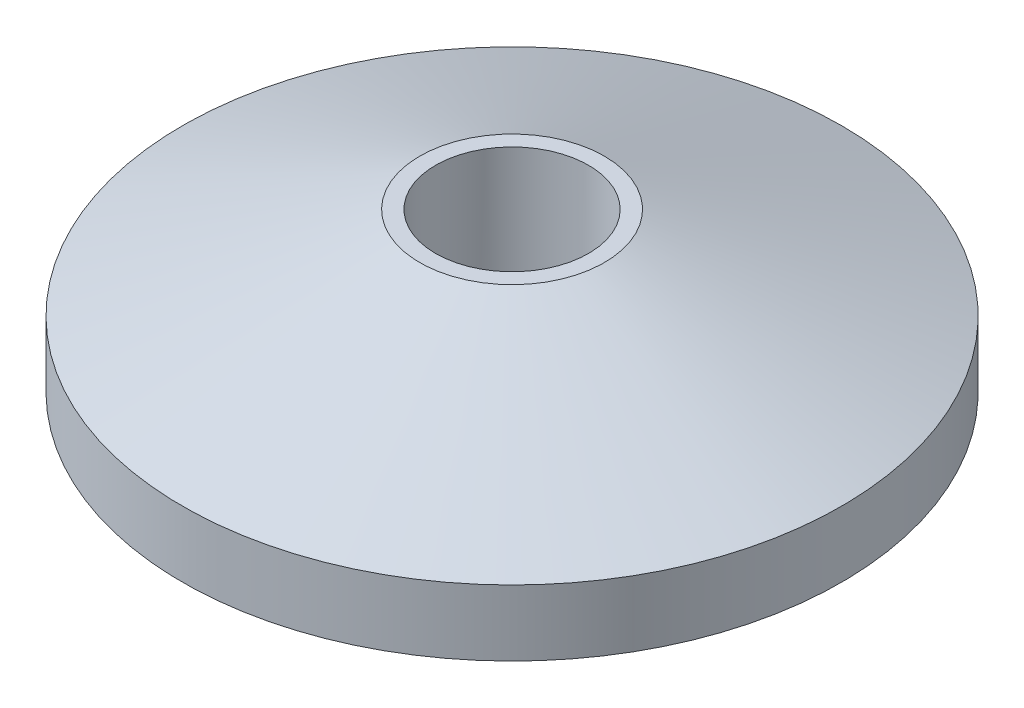
ISO-10303-21;
HEADER;
FILE_DESCRIPTION(('STEP AP214'),'2;1');
FILE_NAME('part.step','',(''),(''),'','','');
FILE_SCHEMA(('AUTOMOTIVE_DESIGN { 1 0 10303 214 1 1 1 1 }'));
ENDSEC;
DATA;
#1=APPLICATION_CONTEXT('core data for automotive mechanical design processes');
#2=APPLICATION_PROTOCOL_DEFINITION('international standard','automotive_design',2000,#1);
#3=PRODUCT_CONTEXT('',#1,'mechanical');
#4=PRODUCT('Part','Part','',(#3));
#5=PRODUCT_RELATED_PRODUCT_CATEGORY('part','',(#4));
#6=PRODUCT_DEFINITION_FORMATION('','',#4);
#7=PRODUCT_DEFINITION_CONTEXT('part definition',#1,'design');
#8=PRODUCT_DEFINITION('design','',#6,#7);
#9=PRODUCT_DEFINITION_SHAPE('','',#8);
#10=(LENGTH_UNIT() NAMED_UNIT(*) SI_UNIT(.MILLI.,.METRE.));
#11=(NAMED_UNIT(*) PLANE_ANGLE_UNIT() SI_UNIT($,.RADIAN.));
#12=(NAMED_UNIT(*) SI_UNIT($,.STERADIAN.) SOLID_ANGLE_UNIT());
#13=UNCERTAINTY_MEASURE_WITH_UNIT(LENGTH_MEASURE(1.E-05),#10,'distance_accuracy_value','');
#14=(GEOMETRIC_REPRESENTATION_CONTEXT(3) GLOBAL_UNCERTAINTY_ASSIGNED_CONTEXT((#13)) GLOBAL_UNIT_ASSIGNED_CONTEXT((#10,
#11,#12)) REPRESENTATION_CONTEXT('',''));
#15=CARTESIAN_POINT('',(0.,0.,0.));
#16=DIRECTION('',(0.,0.,1.));
#17=DIRECTION('',(1.,0.,0.));
#18=AXIS2_PLACEMENT_3D('',#15,#16,#17);
#19=CARTESIAN_POINT('',(0.,0.,0.));
#20=DIRECTION('',(0.,-1.,0.));
#21=DIRECTION('',(0.,0.,-1.));
#22=AXIS2_PLACEMENT_3D('',#19,#20,#21);
#23=PLANE('',#22);
#24=CARTESIAN_POINT('',(0.,0.,0.));
#25=DIRECTION('',(0.,-1.,0.));
#26=DIRECTION('',(0.,0.,-1.));
#27=AXIS2_PLACEMENT_3D('',#24,#25,#26);
#28=CIRCLE('',#27,12.5);
#29=CARTESIAN_POINT('',(0.,0.,-12.5));
#30=VERTEX_POINT('',#29);
#31=EDGE_CURVE('E11',#30,#30,#28,.T.);
#32=ORIENTED_EDGE('',*,*,#31,.T.);
#33=EDGE_LOOP('',(#32));
#34=FACE_BOUND('',#33,.T.);
#35=ADVANCED_FACE('F33',(#34),#23,.T.);
#36=CARTESIAN_POINT('',(0.,6.,0.));
#37=DIRECTION('',(0.,-1.,0.));
#38=DIRECTION('',(0.,0.,-1.));
#39=AXIS2_PLACEMENT_3D('',#36,#37,#38);
#40=CYLINDRICAL_SURFACE('',#39,12.5);
#41=CARTESIAN_POINT('',(0.,2.5,0.));
#42=DIRECTION('',(0.,-1.,0.));
#43=DIRECTION('',(0.,0.,-1.));
#44=AXIS2_PLACEMENT_3D('',#41,#42,#43);
#45=CIRCLE('',#44,12.5);
#46=CARTESIAN_POINT('',(0.,2.5,-12.5));
#47=VERTEX_POINT('',#46);
#48=EDGE_CURVE('E39',#47,#47,#45,.T.);
#49=ORIENTED_EDGE('',*,*,#48,.T.);
#50=EDGE_LOOP('',(#49));
#51=FACE_BOUND('',#50,.T.);
#52=ORIENTED_EDGE('',*,*,#31,.F.);
#53=EDGE_LOOP('',(#52));
#54=FACE_BOUND('',#53,.T.);
#55=ADVANCED_FACE('F69',(#51,#54),#40,.T.);
#56=CARTESIAN_POINT('',(0.,2.5,0.));
#57=DIRECTION('',(0.,-1.,0.));
#58=DIRECTION('',(0.,0.,-1.));
#59=AXIS2_PLACEMENT_3D('',#56,#57,#58);
#60=CONICAL_SURFACE('',#59,12.5,1.19990503798223);
#61=CARTESIAN_POINT('',(0.,6.,0.));
#62=DIRECTION('',(0.,-1.,0.));
#63=DIRECTION('',(0.,0.,-1.));
#64=AXIS2_PLACEMENT_3D('',#61,#62,#63);
#65=CIRCLE('',#64,3.5);
#66=CARTESIAN_POINT('',(0.,6.,-3.5));
#67=VERTEX_POINT('',#66);
#68=EDGE_CURVE('E43',#67,#67,#65,.T.);
#69=CARTESIAN_POINT('',(0.,6.,-3.5));
#70=CARTESIAN_POINT('',(0.,5.96354166666667,-3.59375));
#71=CARTESIAN_POINT('',(0.,5.92708333333333,-3.6875));
#72=CARTESIAN_POINT('',(0.,5.85416666666667,-3.875));
#73=CARTESIAN_POINT('',(0.,5.81770833333333,-3.96875));
#74=CARTESIAN_POINT('',(0.,5.74479166666667,-4.15625));
#75=CARTESIAN_POINT('',(0.,5.70833333333333,-4.25));
#76=CARTESIAN_POINT('',(0.,5.63541666666667,-4.4375));
#77=CARTESIAN_POINT('',(0.,5.59895833333333,-4.53125));
#78=CARTESIAN_POINT('',(0.,5.52604166666667,-4.71875));
#79=CARTESIAN_POINT('',(0.,5.48958333333333,-4.8125));
#80=CARTESIAN_POINT('',(0.,5.41666666666667,-5.));
#81=CARTESIAN_POINT('',(0.,5.38020833333333,-5.09375));
#82=CARTESIAN_POINT('',(0.,5.30729166666667,-5.28125));
#83=CARTESIAN_POINT('',(0.,5.27083333333333,-5.375));
#84=CARTESIAN_POINT('',(0.,5.19791666666667,-5.5625));
#85=CARTESIAN_POINT('',(0.,5.16145833333333,-5.65625));
#86=CARTESIAN_POINT('',(0.,5.08854166666667,-5.84375));
#87=CARTESIAN_POINT('',(0.,5.05208333333333,-5.9375));
#88=CARTESIAN_POINT('',(0.,4.97916666666667,-6.125));
#89=CARTESIAN_POINT('',(0.,4.94270833333333,-6.21875));
#90=CARTESIAN_POINT('',(0.,4.86979166666667,-6.40625));
#91=CARTESIAN_POINT('',(0.,4.83333333333333,-6.5));
#92=CARTESIAN_POINT('',(0.,4.76041666666667,-6.6875));
#93=CARTESIAN_POINT('',(0.,4.72395833333333,-6.78125));
#94=CARTESIAN_POINT('',(0.,4.65104166666667,-6.96875));
#95=CARTESIAN_POINT('',(0.,4.61458333333333,-7.0625));
#96=CARTESIAN_POINT('',(0.,4.54166666666667,-7.25));
#97=CARTESIAN_POINT('',(0.,4.50520833333333,-7.34375));
#98=CARTESIAN_POINT('',(0.,4.43229166666667,-7.53125));
#99=CARTESIAN_POINT('',(0.,4.39583333333333,-7.625));
#100=CARTESIAN_POINT('',(0.,4.32291666666667,-7.8125));
#101=CARTESIAN_POINT('',(0.,4.28645833333333,-7.90625));
#102=CARTESIAN_POINT('',(0.,4.21354166666667,-8.09375));
#103=CARTESIAN_POINT('',(0.,4.17708333333333,-8.1875));
#104=CARTESIAN_POINT('',(0.,4.10416666666667,-8.375));
#105=CARTESIAN_POINT('',(0.,4.06770833333333,-8.46875));
#106=CARTESIAN_POINT('',(0.,3.99479166666667,-8.65625));
#107=CARTESIAN_POINT('',(0.,3.95833333333333,-8.75));
#108=CARTESIAN_POINT('',(0.,3.88541666666667,-8.9375));
#109=CARTESIAN_POINT('',(0.,3.84895833333333,-9.03125));
#110=CARTESIAN_POINT('',(0.,3.77604166666667,-9.21875));
#111=CARTESIAN_POINT('',(0.,3.73958333333333,-9.3125));
#112=CARTESIAN_POINT('',(0.,3.66666666666667,-9.5));
#113=CARTESIAN_POINT('',(0.,3.63020833333333,-9.59375));
#114=CARTESIAN_POINT('',(0.,3.55729166666667,-9.78125));
#115=CARTESIAN_POINT('',(0.,3.52083333333333,-9.875));
#116=CARTESIAN_POINT('',(0.,3.44791666666667,-10.0625));
#117=CARTESIAN_POINT('',(0.,3.41145833333333,-10.15625));
#118=CARTESIAN_POINT('',(0.,3.33854166666667,-10.34375));
#119=CARTESIAN_POINT('',(0.,3.30208333333333,-10.4375));
#120=CARTESIAN_POINT('',(0.,3.22916666666667,-10.625));
#121=CARTESIAN_POINT('',(0.,3.19270833333333,-10.71875));
#122=CARTESIAN_POINT('',(0.,3.11979166666667,-10.90625));
#123=CARTESIAN_POINT('',(0.,3.08333333333333,-11.));
#124=CARTESIAN_POINT('',(0.,3.01041666666667,-11.1875));
#125=CARTESIAN_POINT('',(0.,2.97395833333333,-11.28125));
#126=CARTESIAN_POINT('',(0.,2.90104166666667,-11.46875));
#127=CARTESIAN_POINT('',(0.,2.86458333333333,-11.5625));
#128=CARTESIAN_POINT('',(0.,2.79166666666667,-11.75));
#129=CARTESIAN_POINT('',(0.,2.75520833333333,-11.84375));
#130=CARTESIAN_POINT('',(0.,2.68229166666667,-12.03125));
#131=CARTESIAN_POINT('',(0.,2.64583333333333,-12.125));
#132=CARTESIAN_POINT('',(0.,2.57291666666667,-12.3125));
#133=CARTESIAN_POINT('',(0.,2.53645833333333,-12.40625));
#134=CARTESIAN_POINT('',(0.,2.5,-12.5));
#135=B_SPLINE_CURVE_WITH_KNOTS('',3,(#69,#70,#71,#72,#73,#74,#75,#76,#77,#78,#79,#80,#81,#82,
#83,#84,#85,#86,#87,#88,#89,#90,#91,#92,#93,#94,#95,#96,#97,#98,#99,#100,#101,#102,#103,#104,
#105,#106,#107,#108,#109,#110,#111,#112,#113,#114,#115,#116,#117,#118,#119,#120,#121,#122,#123,
#124,#125,#126,#127,#128,#129,#130,#131,#132,#133,#134),.UNSPECIFIED.,.F.,.F.,(4,2,2,2,2,2,2,2,
2,2,2,2,2,2,2,2,2,2,2,2,2,2,2,2,2,2,2,2,2,2,2,2,4),(0.,0.301768873684812,0.603537747369624,
0.905306621054437,1.20707549473925,1.50884436842406,1.81061324210887,2.11238211579368,
2.41415098947849,2.71591986316331,3.01768873684812,3.31945761053293,3.62122648421774,
3.92299535790255,4.22476423158737,4.52653310527218,4.82830197895699,5.1300708526418,
5.43183972632661,5.73360860001143,6.03537747369624,6.33714634738105,6.63891522106586,
6.94068409475067,7.24245296843549,7.5442218421203,7.84599071580511,8.14775958948992,
8.44952846317473,8.75129733685955,9.05306621054436,9.35483508422917,9.65660395791398),.UNSPECIFIED.);
#136=EDGE_CURVE('BSEAM63',#67,#47,#135,.T.);
#137=ORIENTED_EDGE('',*,*,#68,.T.);
#138=ORIENTED_EDGE('',*,*,#48,.F.);
#139=ORIENTED_EDGE('',*,*,#136,.T.);
#140=ORIENTED_EDGE('',*,*,#136,.F.);
#141=EDGE_LOOP('',(#137,#139,#138,#140));
#142=FACE_BOUND('',#141,.T.);
#143=ADVANCED_FACE('F63',(#142),#60,.T.);
#144=CARTESIAN_POINT('',(0.,6.,-3.5));
#145=DIRECTION('',(0.,1.,0.));
#146=DIRECTION('',(0.,0.,1.));
#147=AXIS2_PLACEMENT_3D('',#144,#145,#146);
#148=PLANE('',#147);
#149=CARTESIAN_POINT('',(0.,6.,0.));
#150=DIRECTION('',(0.,1.,0.));
#151=DIRECTION('',(0.,0.,1.));
#152=AXIS2_PLACEMENT_3D('',#149,#150,#151);
#153=CIRCLE('',#152,2.9);
#154=CARTESIAN_POINT('',(0.,6.,2.9));
#155=VERTEX_POINT('',#154);
#156=EDGE_CURVE('E52',#155,#155,#153,.T.);
#157=ORIENTED_EDGE('',*,*,#156,.F.);
#158=EDGE_LOOP('',(#157));
#159=FACE_BOUND('',#158,.T.);
#160=ORIENTED_EDGE('',*,*,#68,.F.);
#161=EDGE_LOOP('',(#160));
#162=FACE_BOUND('',#161,.T.);
#163=ADVANCED_FACE('F59',(#159,#162),#148,.T.);
#164=CARTESIAN_POINT('',(0.,1.,0.));
#165=DIRECTION('',(0.,-1.,0.));
#166=DIRECTION('',(0.,0.,-1.));
#167=AXIS2_PLACEMENT_3D('',#164,#165,#166);
#168=PLANE('',#167);
#169=CARTESIAN_POINT('',(0.,0.999999999999999,0.));
#170=DIRECTION('',(0.,-1.,0.));
#171=DIRECTION('',(0.,0.,-1.));
#172=AXIS2_PLACEMENT_3D('',#169,#170,#171);
#173=CIRCLE('',#172,2.9);
#174=CARTESIAN_POINT('',(0.,0.999999999999999,-2.9));
#175=VERTEX_POINT('',#174);
#176=EDGE_CURVE('E47',#175,#175,#173,.F.);
#177=ORIENTED_EDGE('',*,*,#176,.T.);
#178=EDGE_LOOP('',(#177));
#179=FACE_BOUND('',#178,.T.);
#180=ADVANCED_FACE('F62',(#179),#168,.F.);
#181=CARTESIAN_POINT('',(0.,-8.20243866176395,0.));
#182=DIRECTION('',(0.,1.,0.));
#183=DIRECTION('',(0.,0.,1.));
#184=AXIS2_PLACEMENT_3D('',#181,#182,#183);
#185=CYLINDRICAL_SURFACE('',#184,2.9);
#186=ORIENTED_EDGE('',*,*,#156,.T.);
#187=EDGE_LOOP('',(#186));
#188=FACE_BOUND('',#187,.T.);
#189=ORIENTED_EDGE('',*,*,#176,.F.);
#190=EDGE_LOOP('',(#189));
#191=FACE_BOUND('',#190,.T.);
#192=ADVANCED_FACE('F56',(#188,#191),#185,.F.);
#193=CLOSED_SHELL('',(#35,#55,#143,#163,#180,#192));
#194=MANIFOLD_SOLID_BREP('B2',#193);
#195=ADVANCED_BREP_SHAPE_REPRESENTATION('',(#18,#194),#14);
#196=SHAPE_DEFINITION_REPRESENTATION(#9,#195);
ENDSEC;
END-ISO-10303-21;
